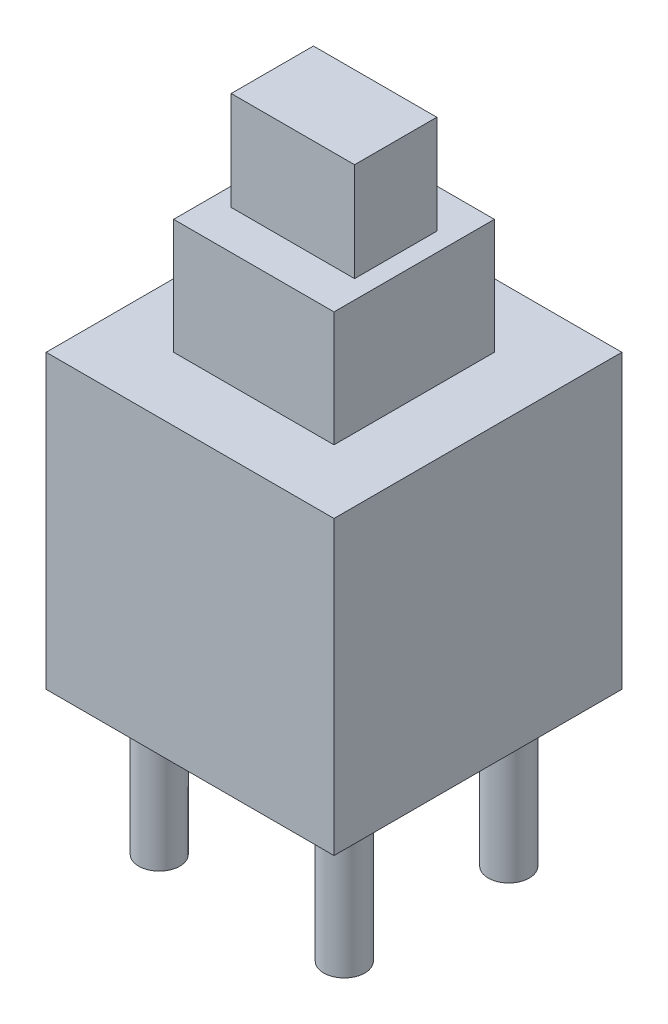
ISO-10303-21;
HEADER;
FILE_DESCRIPTION(('STEP AP214'),'2;1');
FILE_NAME('part.step','',(''),(''),'','','');
FILE_SCHEMA(('AUTOMOTIVE_DESIGN { 1 0 10303 214 1 1 1 1 }'));
ENDSEC;
DATA;
#1=APPLICATION_CONTEXT('core data for automotive mechanical design processes');
#2=APPLICATION_PROTOCOL_DEFINITION('international standard','automotive_design',2000,#1);
#3=PRODUCT_CONTEXT('',#1,'mechanical');
#4=PRODUCT('Part','Part','',(#3));
#5=PRODUCT_RELATED_PRODUCT_CATEGORY('part','',(#4));
#6=PRODUCT_DEFINITION_FORMATION('','',#4);
#7=PRODUCT_DEFINITION_CONTEXT('part definition',#1,'design');
#8=PRODUCT_DEFINITION('design','',#6,#7);
#9=PRODUCT_DEFINITION_SHAPE('','',#8);
#10=(LENGTH_UNIT() NAMED_UNIT(*) SI_UNIT(.MILLI.,.METRE.));
#11=(NAMED_UNIT(*) PLANE_ANGLE_UNIT() SI_UNIT($,.RADIAN.));
#12=(NAMED_UNIT(*) SI_UNIT($,.STERADIAN.) SOLID_ANGLE_UNIT());
#13=UNCERTAINTY_MEASURE_WITH_UNIT(LENGTH_MEASURE(1.E-05),#10,'distance_accuracy_value','');
#14=(GEOMETRIC_REPRESENTATION_CONTEXT(3) GLOBAL_UNCERTAINTY_ASSIGNED_CONTEXT((#13)) GLOBAL_UNIT_ASSIGNED_CONTEXT((#10,
#11,#12)) REPRESENTATION_CONTEXT('',''));
#15=CARTESIAN_POINT('',(0.,0.,0.));
#16=DIRECTION('',(0.,0.,1.));
#17=DIRECTION('',(1.,0.,0.));
#18=AXIS2_PLACEMENT_3D('',#15,#16,#17);
#19=CARTESIAN_POINT('',(0.,7.1,0.));
#20=DIRECTION('',(0.,-1.,0.));
#21=DIRECTION('',(0.,0.,-1.));
#22=AXIS2_PLACEMENT_3D('',#19,#20,#21);
#23=PLANE('',#22);
#24=DIRECTION('',(0.,0.,1.));
#25=VECTOR('',#24,1.);
#26=CARTESIAN_POINT('',(0.,7.1,0.));
#27=LINE('',#26,#25);
#28=CARTESIAN_POINT('',(0.,7.1,-7.));
#29=VERTEX_POINT('',#28);
#30=CARTESIAN_POINT('',(0.,7.1,0.));
#31=VERTEX_POINT('',#30);
#32=EDGE_CURVE('E221',#29,#31,#27,.T.);
#33=ORIENTED_EDGE('',*,*,#32,.T.);
#34=DIRECTION('',(1.,0.,0.));
#35=VECTOR('',#34,1.);
#36=CARTESIAN_POINT('',(0.,7.1,0.));
#37=LINE('',#36,#35);
#38=CARTESIAN_POINT('',(7.,7.1,0.));
#39=VERTEX_POINT('',#38);
#40=EDGE_CURVE('E224',#31,#39,#37,.T.);
#41=ORIENTED_EDGE('',*,*,#40,.T.);
#42=DIRECTION('',(0.,0.,-1.));
#43=VECTOR('',#42,1.);
#44=CARTESIAN_POINT('',(7.,7.1,0.));
#45=LINE('',#44,#43);
#46=CARTESIAN_POINT('',(7.,7.1,-7.));
#47=VERTEX_POINT('',#46);
#48=EDGE_CURVE('E227',#39,#47,#45,.T.);
#49=ORIENTED_EDGE('',*,*,#48,.T.);
#50=DIRECTION('',(-1.,0.,0.));
#51=VECTOR('',#50,1.);
#52=CARTESIAN_POINT('',(0.,7.1,-7.));
#53=LINE('',#52,#51);
#54=EDGE_CURVE('E229',#47,#29,#53,.T.);
#55=ORIENTED_EDGE('',*,*,#54,.T.);
#56=EDGE_LOOP('',(#33,#41,#49,#55));
#57=FACE_BOUND('',#56,.T.);
#58=DIRECTION('',(0.,0.,1.));
#59=VECTOR('',#58,1.);
#60=CARTESIAN_POINT('',(1.55,7.1,-5.45));
#61=LINE('',#60,#59);
#62=CARTESIAN_POINT('',(1.55,7.1,-5.45));
#63=VERTEX_POINT('',#62);
#64=CARTESIAN_POINT('',(1.55,7.1,-1.55));
#65=VERTEX_POINT('',#64);
#66=EDGE_CURVE('E185',#63,#65,#61,.T.);
#67=ORIENTED_EDGE('',*,*,#66,.F.);
#68=DIRECTION('',(-1.,0.,0.));
#69=VECTOR('',#68,1.);
#70=CARTESIAN_POINT('',(1.55,7.1,-5.45));
#71=LINE('',#70,#69);
#72=CARTESIAN_POINT('',(5.45,7.1,-5.45));
#73=VERTEX_POINT('',#72);
#74=EDGE_CURVE('E192',#73,#63,#71,.T.);
#75=ORIENTED_EDGE('',*,*,#74,.F.);
#76=DIRECTION('',(0.,0.,-1.));
#77=VECTOR('',#76,1.);
#78=CARTESIAN_POINT('',(5.45,7.1,-5.45));
#79=LINE('',#78,#77);
#80=CARTESIAN_POINT('',(5.45,7.1,-1.55));
#81=VERTEX_POINT('',#80);
#82=EDGE_CURVE('E204',#81,#73,#79,.T.);
#83=ORIENTED_EDGE('',*,*,#82,.F.);
#84=DIRECTION('',(1.,0.,0.));
#85=VECTOR('',#84,1.);
#86=CARTESIAN_POINT('',(1.55,7.1,-1.55));
#87=LINE('',#86,#85);
#88=EDGE_CURVE('E201',#65,#81,#87,.T.);
#89=ORIENTED_EDGE('',*,*,#88,.F.);
#90=EDGE_LOOP('',(#67,#75,#83,#89));
#91=FACE_BOUND('',#90,.T.);
#92=ADVANCED_FACE('F42',(#57,#91),#23,.F.);
#93=CARTESIAN_POINT('',(0.,7.1,0.));
#94=DIRECTION('',(1.,0.,0.));
#95=DIRECTION('',(0.,0.,-1.));
#96=AXIS2_PLACEMENT_3D('',#93,#94,#95);
#97=PLANE('',#96);
#98=DIRECTION('',(0.,0.,1.));
#99=VECTOR('',#98,1.);
#100=CARTESIAN_POINT('',(0.,0.,0.));
#101=LINE('',#100,#99);
#102=CARTESIAN_POINT('',(0.,0.,-7.));
#103=VERTEX_POINT('',#102);
#104=CARTESIAN_POINT('',(0.,0.,0.));
#105=VERTEX_POINT('',#104);
#106=EDGE_CURVE('E220',#103,#105,#101,.T.);
#107=ORIENTED_EDGE('',*,*,#106,.T.);
#108=DIRECTION('',(0.,-1.,0.));
#109=VECTOR('',#108,1.);
#110=CARTESIAN_POINT('',(0.,7.1,0.));
#111=LINE('',#110,#109);
#112=EDGE_CURVE('E12',#31,#105,#111,.T.);
#113=ORIENTED_EDGE('',*,*,#112,.F.);
#114=ORIENTED_EDGE('',*,*,#32,.F.);
#115=DIRECTION('',(0.,-1.,0.));
#116=VECTOR('',#115,1.);
#117=CARTESIAN_POINT('',(0.,7.1,-7.));
#118=LINE('',#117,#116);
#119=EDGE_CURVE('E231',#29,#103,#118,.T.);
#120=ORIENTED_EDGE('',*,*,#119,.T.);
#121=EDGE_LOOP('',(#107,#113,#114,#120));
#122=FACE_BOUND('',#121,.T.);
#123=ADVANCED_FACE('F44',(#122),#97,.F.);
#124=CARTESIAN_POINT('',(0.,7.1,0.));
#125=DIRECTION('',(0.,0.,-1.));
#126=DIRECTION('',(-1.,0.,0.));
#127=AXIS2_PLACEMENT_3D('',#124,#125,#126);
#128=PLANE('',#127);
#129=DIRECTION('',(1.,0.,0.));
#130=VECTOR('',#129,1.);
#131=CARTESIAN_POINT('',(0.,0.,0.));
#132=LINE('',#131,#130);
#133=CARTESIAN_POINT('',(7.,0.,0.));
#134=VERTEX_POINT('',#133);
#135=EDGE_CURVE('E234',#105,#134,#132,.T.);
#136=ORIENTED_EDGE('',*,*,#135,.T.);
#137=DIRECTION('',(0.,-1.,0.));
#138=VECTOR('',#137,1.);
#139=CARTESIAN_POINT('',(7.,7.1,0.));
#140=LINE('',#139,#138);
#141=EDGE_CURVE('E50',#39,#134,#140,.T.);
#142=ORIENTED_EDGE('',*,*,#141,.F.);
#143=ORIENTED_EDGE('',*,*,#40,.F.);
#144=ORIENTED_EDGE('',*,*,#112,.T.);
#145=EDGE_LOOP('',(#136,#142,#143,#144));
#146=FACE_BOUND('',#145,.T.);
#147=ADVANCED_FACE('F264',(#146),#128,.F.);
#148=CARTESIAN_POINT('',(7.,7.1,0.));
#149=DIRECTION('',(-1.,0.,0.));
#150=DIRECTION('',(0.,0.,1.));
#151=AXIS2_PLACEMENT_3D('',#148,#149,#150);
#152=PLANE('',#151);
#153=DIRECTION('',(0.,0.,-1.));
#154=VECTOR('',#153,1.);
#155=CARTESIAN_POINT('',(7.,0.,0.));
#156=LINE('',#155,#154);
#157=CARTESIAN_POINT('',(7.,0.,-7.));
#158=VERTEX_POINT('',#157);
#159=EDGE_CURVE('E236',#134,#158,#156,.T.);
#160=ORIENTED_EDGE('',*,*,#159,.T.);
#161=DIRECTION('',(0.,-1.,0.));
#162=VECTOR('',#161,1.);
#163=CARTESIAN_POINT('',(7.,7.1,-7.));
#164=LINE('',#163,#162);
#165=EDGE_CURVE('E241',#47,#158,#164,.T.);
#166=ORIENTED_EDGE('',*,*,#165,.F.);
#167=ORIENTED_EDGE('',*,*,#48,.F.);
#168=ORIENTED_EDGE('',*,*,#141,.T.);
#169=EDGE_LOOP('',(#160,#166,#167,#168));
#170=FACE_BOUND('',#169,.T.);
#171=ADVANCED_FACE('F248',(#170),#152,.F.);
#172=CARTESIAN_POINT('',(0.,7.1,-7.));
#173=DIRECTION('',(0.,0.,1.));
#174=DIRECTION('',(1.,0.,0.));
#175=AXIS2_PLACEMENT_3D('',#172,#173,#174);
#176=PLANE('',#175);
#177=DIRECTION('',(-1.,0.,0.));
#178=VECTOR('',#177,1.);
#179=CARTESIAN_POINT('',(0.,0.,-7.));
#180=LINE('',#179,#178);
#181=EDGE_CURVE('E225',#158,#103,#180,.T.);
#182=ORIENTED_EDGE('',*,*,#181,.T.);
#183=ORIENTED_EDGE('',*,*,#119,.F.);
#184=ORIENTED_EDGE('',*,*,#54,.F.);
#185=ORIENTED_EDGE('',*,*,#165,.T.);
#186=EDGE_LOOP('',(#182,#183,#184,#185));
#187=FACE_BOUND('',#186,.T.);
#188=ADVANCED_FACE('F257',(#187),#176,.F.);
#189=CARTESIAN_POINT('',(0.,0.,0.));
#190=DIRECTION('',(0.,-1.,0.));
#191=DIRECTION('',(0.,0.,-1.));
#192=AXIS2_PLACEMENT_3D('',#189,#190,#191);
#193=PLANE('',#192);
#194=CARTESIAN_POINT('',(1.25,0.,-5.5));
#195=DIRECTION('',(0.,-1.,0.));
#196=DIRECTION('',(0.,0.,-1.));
#197=AXIS2_PLACEMENT_3D('',#194,#195,#196);
#198=CIRCLE('',#197,0.500000000000001);
#199=CARTESIAN_POINT('',(1.25,0.,-6.));
#200=VERTEX_POINT('',#199);
#201=EDGE_CURVE('E162',#200,#200,#198,.T.);
#202=ORIENTED_EDGE('',*,*,#201,.F.);
#203=EDGE_LOOP('',(#202));
#204=FACE_BOUND('',#203,.T.);
#205=CARTESIAN_POINT('',(5.75,0.,-5.5));
#206=DIRECTION('',(0.,-1.,0.));
#207=DIRECTION('',(0.,0.,-1.));
#208=AXIS2_PLACEMENT_3D('',#205,#206,#207);
#209=CIRCLE('',#208,0.500000000000002);
#210=CARTESIAN_POINT('',(5.75,0.,-6.));
#211=VERTEX_POINT('',#210);
#212=EDGE_CURVE('E170',#211,#211,#209,.T.);
#213=ORIENTED_EDGE('',*,*,#212,.F.);
#214=EDGE_LOOP('',(#213));
#215=FACE_BOUND('',#214,.T.);
#216=CARTESIAN_POINT('',(5.75,0.,-1.5));
#217=DIRECTION('',(0.,-1.,0.));
#218=DIRECTION('',(0.,0.,-1.));
#219=AXIS2_PLACEMENT_3D('',#216,#217,#218);
#220=CIRCLE('',#219,0.5);
#221=CARTESIAN_POINT('',(5.75,0.,-2.));
#222=VERTEX_POINT('',#221);
#223=EDGE_CURVE('E176',#222,#222,#220,.T.);
#224=ORIENTED_EDGE('',*,*,#223,.F.);
#225=EDGE_LOOP('',(#224));
#226=FACE_BOUND('',#225,.T.);
#227=CARTESIAN_POINT('',(1.25,0.,-1.5));
#228=DIRECTION('',(0.,-1.,0.));
#229=DIRECTION('',(0.,0.,-1.));
#230=AXIS2_PLACEMENT_3D('',#227,#228,#229);
#231=CIRCLE('',#230,0.5);
#232=CARTESIAN_POINT('',(1.25,0.,-2.));
#233=VERTEX_POINT('',#232);
#234=EDGE_CURVE('E179',#233,#233,#231,.T.);
#235=ORIENTED_EDGE('',*,*,#234,.F.);
#236=EDGE_LOOP('',(#235));
#237=FACE_BOUND('',#236,.T.);
#238=ORIENTED_EDGE('',*,*,#106,.F.);
#239=ORIENTED_EDGE('',*,*,#181,.F.);
#240=ORIENTED_EDGE('',*,*,#159,.F.);
#241=ORIENTED_EDGE('',*,*,#135,.F.);
#242=EDGE_LOOP('',(#238,#239,#240,#241));
#243=FACE_BOUND('',#242,.T.);
#244=ADVANCED_FACE('F254',(#204,#215,#226,#237,#243),#193,.T.);
#245=CARTESIAN_POINT('',(1.55,9.9,-5.45));
#246=DIRECTION('',(1.,0.,0.));
#247=DIRECTION('',(0.,0.,-1.));
#248=AXIS2_PLACEMENT_3D('',#245,#246,#247);
#249=PLANE('',#248);
#250=ORIENTED_EDGE('',*,*,#66,.T.);
#251=DIRECTION('',(0.,-1.,0.));
#252=VECTOR('',#251,1.);
#253=CARTESIAN_POINT('',(1.55,9.9,-1.55));
#254=LINE('',#253,#252);
#255=CARTESIAN_POINT('',(1.55,9.9,-1.55));
#256=VERTEX_POINT('',#255);
#257=EDGE_CURVE('E217',#256,#65,#254,.T.);
#258=ORIENTED_EDGE('',*,*,#257,.F.);
#259=DIRECTION('',(0.,0.,1.));
#260=VECTOR('',#259,1.);
#261=CARTESIAN_POINT('',(1.55,9.9,-5.45));
#262=LINE('',#261,#260);
#263=CARTESIAN_POINT('',(1.55,9.9,-5.45));
#264=VERTEX_POINT('',#263);
#265=EDGE_CURVE('E188',#264,#256,#262,.T.);
#266=ORIENTED_EDGE('',*,*,#265,.F.);
#267=DIRECTION('',(0.,-1.,0.));
#268=VECTOR('',#267,1.);
#269=CARTESIAN_POINT('',(1.55,9.9,-5.45));
#270=LINE('',#269,#268);
#271=EDGE_CURVE('E198',#264,#63,#270,.T.);
#272=ORIENTED_EDGE('',*,*,#271,.T.);
#273=EDGE_LOOP('',(#250,#258,#266,#272));
#274=FACE_BOUND('',#273,.T.);
#275=ADVANCED_FACE('F277',(#274),#249,.F.);
#276=CARTESIAN_POINT('',(1.55,9.9,-1.55));
#277=DIRECTION('',(0.,0.,-1.));
#278=DIRECTION('',(-1.,0.,0.));
#279=AXIS2_PLACEMENT_3D('',#276,#277,#278);
#280=PLANE('',#279);
#281=ORIENTED_EDGE('',*,*,#88,.T.);
#282=DIRECTION('',(0.,-1.,0.));
#283=VECTOR('',#282,1.);
#284=CARTESIAN_POINT('',(5.45,9.9,-1.55));
#285=LINE('',#284,#283);
#286=CARTESIAN_POINT('',(5.45,9.9,-1.55));
#287=VERTEX_POINT('',#286);
#288=EDGE_CURVE('E214',#287,#81,#285,.T.);
#289=ORIENTED_EDGE('',*,*,#288,.F.);
#290=DIRECTION('',(1.,0.,0.));
#291=VECTOR('',#290,1.);
#292=CARTESIAN_POINT('',(1.55,9.9,-1.55));
#293=LINE('',#292,#291);
#294=EDGE_CURVE('E191',#256,#287,#293,.T.);
#295=ORIENTED_EDGE('',*,*,#294,.F.);
#296=ORIENTED_EDGE('',*,*,#257,.T.);
#297=EDGE_LOOP('',(#281,#289,#295,#296));
#298=FACE_BOUND('',#297,.T.);
#299=ADVANCED_FACE('F299',(#298),#280,.F.);
#300=CARTESIAN_POINT('',(5.45,9.9,-5.45));
#301=DIRECTION('',(-1.,0.,0.));
#302=DIRECTION('',(0.,0.,1.));
#303=AXIS2_PLACEMENT_3D('',#300,#301,#302);
#304=PLANE('',#303);
#305=ORIENTED_EDGE('',*,*,#82,.T.);
#306=DIRECTION('',(0.,-1.,0.));
#307=VECTOR('',#306,1.);
#308=CARTESIAN_POINT('',(5.45,9.9,-5.45));
#309=LINE('',#308,#307);
#310=CARTESIAN_POINT('',(5.45,9.9,-5.45));
#311=VERTEX_POINT('',#310);
#312=EDGE_CURVE('E211',#311,#73,#309,.T.);
#313=ORIENTED_EDGE('',*,*,#312,.F.);
#314=DIRECTION('',(0.,0.,-1.));
#315=VECTOR('',#314,1.);
#316=CARTESIAN_POINT('',(5.45,9.9,-5.45));
#317=LINE('',#316,#315);
#318=EDGE_CURVE('E194',#287,#311,#317,.T.);
#319=ORIENTED_EDGE('',*,*,#318,.F.);
#320=ORIENTED_EDGE('',*,*,#288,.T.);
#321=EDGE_LOOP('',(#305,#313,#319,#320));
#322=FACE_BOUND('',#321,.T.);
#323=ADVANCED_FACE('F306',(#322),#304,.F.);
#324=CARTESIAN_POINT('',(1.55,9.9,-5.45));
#325=DIRECTION('',(0.,0.,1.));
#326=DIRECTION('',(1.,0.,0.));
#327=AXIS2_PLACEMENT_3D('',#324,#325,#326);
#328=PLANE('',#327);
#329=ORIENTED_EDGE('',*,*,#74,.T.);
#330=ORIENTED_EDGE('',*,*,#271,.F.);
#331=DIRECTION('',(-1.,0.,0.));
#332=VECTOR('',#331,1.);
#333=CARTESIAN_POINT('',(1.55,9.9,-5.45));
#334=LINE('',#333,#332);
#335=EDGE_CURVE('E196',#311,#264,#334,.T.);
#336=ORIENTED_EDGE('',*,*,#335,.F.);
#337=ORIENTED_EDGE('',*,*,#312,.T.);
#338=EDGE_LOOP('',(#329,#330,#336,#337));
#339=FACE_BOUND('',#338,.T.);
#340=ADVANCED_FACE('F313',(#339),#328,.F.);
#341=CARTESIAN_POINT('',(0.,9.9,0.));
#342=DIRECTION('',(0.,1.,0.));
#343=DIRECTION('',(0.,0.,1.));
#344=AXIS2_PLACEMENT_3D('',#341,#342,#343);
#345=PLANE('',#344);
#346=DIRECTION('',(0.,0.,1.));
#347=VECTOR('',#346,1.);
#348=CARTESIAN_POINT('',(2.,9.9,-4.5));
#349=LINE('',#348,#347);
#350=CARTESIAN_POINT('',(2.,9.9,-4.5));
#351=VERTEX_POINT('',#350);
#352=CARTESIAN_POINT('',(2.,9.9,-2.5));
#353=VERTEX_POINT('',#352);
#354=EDGE_CURVE('E57',#351,#353,#349,.T.);
#355=ORIENTED_EDGE('',*,*,#354,.F.);
#356=DIRECTION('',(-1.,0.,0.));
#357=VECTOR('',#356,1.);
#358=CARTESIAN_POINT('',(2.,9.9,-4.5));
#359=LINE('',#358,#357);
#360=CARTESIAN_POINT('',(5.,9.9,-4.5));
#361=VERTEX_POINT('',#360);
#362=EDGE_CURVE('E62',#361,#351,#359,.T.);
#363=ORIENTED_EDGE('',*,*,#362,.F.);
#364=DIRECTION('',(0.,0.,-1.));
#365=VECTOR('',#364,1.);
#366=CARTESIAN_POINT('',(5.,9.9,-4.5));
#367=LINE('',#366,#365);
#368=CARTESIAN_POINT('',(5.,9.9,-2.5));
#369=VERTEX_POINT('',#368);
#370=EDGE_CURVE('E128',#369,#361,#367,.T.);
#371=ORIENTED_EDGE('',*,*,#370,.F.);
#372=DIRECTION('',(1.,0.,0.));
#373=VECTOR('',#372,1.);
#374=CARTESIAN_POINT('',(2.,9.9,-2.5));
#375=LINE('',#374,#373);
#376=EDGE_CURVE('E133',#353,#369,#375,.T.);
#377=ORIENTED_EDGE('',*,*,#376,.F.);
#378=EDGE_LOOP('',(#355,#363,#371,#377));
#379=FACE_BOUND('',#378,.T.);
#380=ORIENTED_EDGE('',*,*,#265,.T.);
#381=ORIENTED_EDGE('',*,*,#294,.T.);
#382=ORIENTED_EDGE('',*,*,#318,.T.);
#383=ORIENTED_EDGE('',*,*,#335,.T.);
#384=EDGE_LOOP('',(#380,#381,#382,#383));
#385=FACE_BOUND('',#384,.T.);
#386=ADVANCED_FACE('F130',(#379,#385),#345,.T.);
#387=CARTESIAN_POINT('',(1.25,-3.6,-1.5));
#388=DIRECTION('',(0.,1.,0.));
#389=DIRECTION('',(0.,0.,1.));
#390=AXIS2_PLACEMENT_3D('',#387,#388,#389);
#391=CYLINDRICAL_SURFACE('',#390,0.5);
#392=CARTESIAN_POINT('',(1.25,-3.6,-1.5));
#393=DIRECTION('',(0.,-1.,0.));
#394=DIRECTION('',(0.,0.,-1.));
#395=AXIS2_PLACEMENT_3D('',#392,#393,#394);
#396=CIRCLE('',#395,0.5);
#397=CARTESIAN_POINT('',(1.25,-3.6,-2.));
#398=VERTEX_POINT('',#397);
#399=EDGE_CURVE('E182',#398,#398,#396,.T.);
#400=ORIENTED_EDGE('',*,*,#399,.F.);
#401=EDGE_LOOP('',(#400));
#402=FACE_BOUND('',#401,.T.);
#403=ORIENTED_EDGE('',*,*,#234,.T.);
#404=EDGE_LOOP('',(#403));
#405=FACE_BOUND('',#404,.T.);
#406=ADVANCED_FACE('F327',(#402,#405),#391,.T.);
#407=CARTESIAN_POINT('',(1.25,-3.6,-1.5));
#408=DIRECTION('',(0.,-1.,0.));
#409=DIRECTION('',(0.,0.,-1.));
#410=AXIS2_PLACEMENT_3D('',#407,#408,#409);
#411=PLANE('',#410);
#412=ORIENTED_EDGE('',*,*,#399,.T.);
#413=EDGE_LOOP('',(#412));
#414=FACE_BOUND('',#413,.T.);
#415=ADVANCED_FACE('F335',(#414),#411,.T.);
#416=CARTESIAN_POINT('',(5.75,-3.6,-1.5));
#417=DIRECTION('',(0.,1.,0.));
#418=DIRECTION('',(0.,0.,1.));
#419=AXIS2_PLACEMENT_3D('',#416,#417,#418);
#420=CYLINDRICAL_SURFACE('',#419,0.5);
#421=CARTESIAN_POINT('',(5.75,-3.6,-1.5));
#422=DIRECTION('',(0.,-1.,0.));
#423=DIRECTION('',(0.,0.,-1.));
#424=AXIS2_PLACEMENT_3D('',#421,#422,#423);
#425=CIRCLE('',#424,0.5);
#426=CARTESIAN_POINT('',(5.75,-3.6,-2.));
#427=VERTEX_POINT('',#426);
#428=EDGE_CURVE('E173',#427,#427,#425,.T.);
#429=ORIENTED_EDGE('',*,*,#428,.F.);
#430=EDGE_LOOP('',(#429));
#431=FACE_BOUND('',#430,.T.);
#432=ORIENTED_EDGE('',*,*,#223,.T.);
#433=EDGE_LOOP('',(#432));
#434=FACE_BOUND('',#433,.T.);
#435=ADVANCED_FACE('F343',(#431,#434),#420,.T.);
#436=CARTESIAN_POINT('',(5.75,-3.6,-1.5));
#437=DIRECTION('',(0.,-1.,0.));
#438=DIRECTION('',(0.,0.,-1.));
#439=AXIS2_PLACEMENT_3D('',#436,#437,#438);
#440=PLANE('',#439);
#441=ORIENTED_EDGE('',*,*,#428,.T.);
#442=EDGE_LOOP('',(#441));
#443=FACE_BOUND('',#442,.T.);
#444=ADVANCED_FACE('F351',(#443),#440,.T.);
#445=CARTESIAN_POINT('',(5.75,-3.6,-5.5));
#446=DIRECTION('',(0.,1.,0.));
#447=DIRECTION('',(0.,0.,1.));
#448=AXIS2_PLACEMENT_3D('',#445,#446,#447);
#449=CYLINDRICAL_SURFACE('',#448,0.500000000000002);
#450=CARTESIAN_POINT('',(5.75,-3.6,-5.5));
#451=DIRECTION('',(0.,-1.,0.));
#452=DIRECTION('',(0.,0.,-1.));
#453=AXIS2_PLACEMENT_3D('',#450,#451,#452);
#454=CIRCLE('',#453,0.500000000000002);
#455=CARTESIAN_POINT('',(5.75,-3.6,-6.));
#456=VERTEX_POINT('',#455);
#457=EDGE_CURVE('E165',#456,#456,#454,.T.);
#458=ORIENTED_EDGE('',*,*,#457,.F.);
#459=EDGE_LOOP('',(#458));
#460=FACE_BOUND('',#459,.T.);
#461=ORIENTED_EDGE('',*,*,#212,.T.);
#462=EDGE_LOOP('',(#461));
#463=FACE_BOUND('',#462,.T.);
#464=ADVANCED_FACE('F359',(#460,#463),#449,.T.);
#465=CARTESIAN_POINT('',(5.75,-3.6,-5.5));
#466=DIRECTION('',(0.,-1.,0.));
#467=DIRECTION('',(0.,0.,-1.));
#468=AXIS2_PLACEMENT_3D('',#465,#466,#467);
#469=PLANE('',#468);
#470=ORIENTED_EDGE('',*,*,#457,.T.);
#471=EDGE_LOOP('',(#470));
#472=FACE_BOUND('',#471,.T.);
#473=ADVANCED_FACE('F367',(#472),#469,.T.);
#474=CARTESIAN_POINT('',(1.25,-3.6,-5.5));
#475=DIRECTION('',(0.,1.,0.));
#476=DIRECTION('',(0.,0.,1.));
#477=AXIS2_PLACEMENT_3D('',#474,#475,#476);
#478=CYLINDRICAL_SURFACE('',#477,0.500000000000001);
#479=CARTESIAN_POINT('',(1.25,-3.6,-5.5));
#480=DIRECTION('',(0.,-1.,0.));
#481=DIRECTION('',(0.,0.,-1.));
#482=AXIS2_PLACEMENT_3D('',#479,#480,#481);
#483=CIRCLE('',#482,0.500000000000001);
#484=CARTESIAN_POINT('',(1.25,-3.6,-6.));
#485=VERTEX_POINT('',#484);
#486=EDGE_CURVE('E166',#485,#485,#483,.T.);
#487=ORIENTED_EDGE('',*,*,#486,.F.);
#488=EDGE_LOOP('',(#487));
#489=FACE_BOUND('',#488,.T.);
#490=ORIENTED_EDGE('',*,*,#201,.T.);
#491=EDGE_LOOP('',(#490));
#492=FACE_BOUND('',#491,.T.);
#493=ADVANCED_FACE('F375',(#489,#492),#478,.T.);
#494=CARTESIAN_POINT('',(1.25,-3.6,-5.5));
#495=DIRECTION('',(0.,-1.,0.));
#496=DIRECTION('',(0.,0.,-1.));
#497=AXIS2_PLACEMENT_3D('',#494,#495,#496);
#498=PLANE('',#497);
#499=ORIENTED_EDGE('',*,*,#486,.T.);
#500=EDGE_LOOP('',(#499));
#501=FACE_BOUND('',#500,.T.);
#502=ADVANCED_FACE('F383',(#501),#498,.T.);
#503=CARTESIAN_POINT('',(2.,28.205551275464,-4.5));
#504=DIRECTION('',(0.,0.,1.));
#505=DIRECTION('',(1.,0.,0.));
#506=AXIS2_PLACEMENT_3D('',#503,#504,#505);
#507=PLANE('',#506);
#508=DIRECTION('',(0.,-1.,0.));
#509=VECTOR('',#508,1.);
#510=CARTESIAN_POINT('',(2.,28.205551275464,-4.5));
#511=LINE('',#510,#509);
#512=CARTESIAN_POINT('',(2.,12.3,-4.5));
#513=VERTEX_POINT('',#512);
#514=EDGE_CURVE('E155',#513,#351,#511,.T.);
#515=ORIENTED_EDGE('',*,*,#514,.F.);
#516=DIRECTION('',(1.,0.,0.));
#517=VECTOR('',#516,1.);
#518=CARTESIAN_POINT('',(2.,12.3,-4.5));
#519=LINE('',#518,#517);
#520=CARTESIAN_POINT('',(5.,12.3,-4.5));
#521=VERTEX_POINT('',#520);
#522=EDGE_CURVE('E159',#513,#521,#519,.T.);
#523=ORIENTED_EDGE('',*,*,#522,.T.);
#524=DIRECTION('',(0.,-1.,0.));
#525=VECTOR('',#524,1.);
#526=CARTESIAN_POINT('',(5.,28.205551275464,-4.5));
#527=LINE('',#526,#525);
#528=EDGE_CURVE('E146',#521,#361,#527,.T.);
#529=ORIENTED_EDGE('',*,*,#528,.T.);
#530=ORIENTED_EDGE('',*,*,#362,.T.);
#531=EDGE_LOOP('',(#515,#523,#529,#530));
#532=FACE_BOUND('',#531,.T.);
#533=ADVANCED_FACE('F390',(#532),#507,.F.);
#534=CARTESIAN_POINT('',(5.,28.205551275464,-4.5));
#535=DIRECTION('',(-1.,0.,0.));
#536=DIRECTION('',(0.,0.,1.));
#537=AXIS2_PLACEMENT_3D('',#534,#535,#536);
#538=PLANE('',#537);
#539=ORIENTED_EDGE('',*,*,#528,.F.);
#540=DIRECTION('',(0.,0.,1.));
#541=VECTOR('',#540,1.);
#542=CARTESIAN_POINT('',(5.,12.3,-4.5));
#543=LINE('',#542,#541);
#544=CARTESIAN_POINT('',(5.,12.3,-2.5));
#545=VERTEX_POINT('',#544);
#546=EDGE_CURVE('E142',#521,#545,#543,.T.);
#547=ORIENTED_EDGE('',*,*,#546,.T.);
#548=DIRECTION('',(0.,-1.,0.));
#549=VECTOR('',#548,1.);
#550=CARTESIAN_POINT('',(5.,28.205551275464,-2.5));
#551=LINE('',#550,#549);
#552=EDGE_CURVE('E140',#545,#369,#551,.T.);
#553=ORIENTED_EDGE('',*,*,#552,.T.);
#554=ORIENTED_EDGE('',*,*,#370,.T.);
#555=EDGE_LOOP('',(#539,#547,#553,#554));
#556=FACE_BOUND('',#555,.T.);
#557=ADVANCED_FACE('F141',(#556),#538,.F.);
#558=CARTESIAN_POINT('',(2.,28.205551275464,-2.5));
#559=DIRECTION('',(0.,0.,-1.));
#560=DIRECTION('',(-1.,0.,0.));
#561=AXIS2_PLACEMENT_3D('',#558,#559,#560);
#562=PLANE('',#561);
#563=ORIENTED_EDGE('',*,*,#552,.F.);
#564=DIRECTION('',(-1.,0.,0.));
#565=VECTOR('',#564,1.);
#566=CARTESIAN_POINT('',(2.,12.3,-2.5));
#567=LINE('',#566,#565);
#568=CARTESIAN_POINT('',(2.,12.3,-2.5));
#569=VERTEX_POINT('',#568);
#570=EDGE_CURVE('E534',#545,#569,#567,.T.);
#571=ORIENTED_EDGE('',*,*,#570,.T.);
#572=DIRECTION('',(0.,-1.,0.));
#573=VECTOR('',#572,1.);
#574=CARTESIAN_POINT('',(2.,28.205551275464,-2.5));
#575=LINE('',#574,#573);
#576=EDGE_CURVE('E145',#569,#353,#575,.T.);
#577=ORIENTED_EDGE('',*,*,#576,.T.);
#578=ORIENTED_EDGE('',*,*,#376,.T.);
#579=EDGE_LOOP('',(#563,#571,#577,#578));
#580=FACE_BOUND('',#579,.T.);
#581=ADVANCED_FACE('F148',(#580),#562,.F.);
#582=CARTESIAN_POINT('',(2.,28.205551275464,-4.5));
#583=DIRECTION('',(1.,0.,0.));
#584=DIRECTION('',(0.,0.,-1.));
#585=AXIS2_PLACEMENT_3D('',#582,#583,#584);
#586=PLANE('',#585);
#587=ORIENTED_EDGE('',*,*,#576,.F.);
#588=DIRECTION('',(0.,0.,-1.));
#589=VECTOR('',#588,1.);
#590=CARTESIAN_POINT('',(2.,12.3,-4.5));
#591=LINE('',#590,#589);
#592=EDGE_CURVE('E169',#569,#513,#591,.T.);
#593=ORIENTED_EDGE('',*,*,#592,.T.);
#594=ORIENTED_EDGE('',*,*,#514,.T.);
#595=ORIENTED_EDGE('',*,*,#354,.T.);
#596=EDGE_LOOP('',(#587,#593,#594,#595));
#597=FACE_BOUND('',#596,.T.);
#598=ADVANCED_FACE('F410',(#597),#586,.F.);
#599=CARTESIAN_POINT('',(0.,12.3,0.));
#600=DIRECTION('',(0.,-1.,0.));
#601=DIRECTION('',(0.,0.,-1.));
#602=AXIS2_PLACEMENT_3D('',#599,#600,#601);
#603=PLANE('',#602);
#604=ORIENTED_EDGE('',*,*,#570,.F.);
#605=ORIENTED_EDGE('',*,*,#546,.F.);
#606=ORIENTED_EDGE('',*,*,#522,.F.);
#607=ORIENTED_EDGE('',*,*,#592,.F.);
#608=EDGE_LOOP('',(#604,#605,#606,#607));
#609=FACE_BOUND('',#608,.T.);
#610=ADVANCED_FACE('F417',(#609),#603,.F.);
#611=CLOSED_SHELL('',(#92,#123,#147,#171,#188,#244,#275,#299,#323,#340,#386,#406,#415,#435,#444,
#464,#473,#493,#502,#533,#557,#581,#598,#610));
#612=MANIFOLD_SOLID_BREP('B2',#611);
#613=ADVANCED_BREP_SHAPE_REPRESENTATION('',(#18,#612),#14);
#614=SHAPE_DEFINITION_REPRESENTATION(#9,#613);
ENDSEC;
END-ISO-10303-21;
